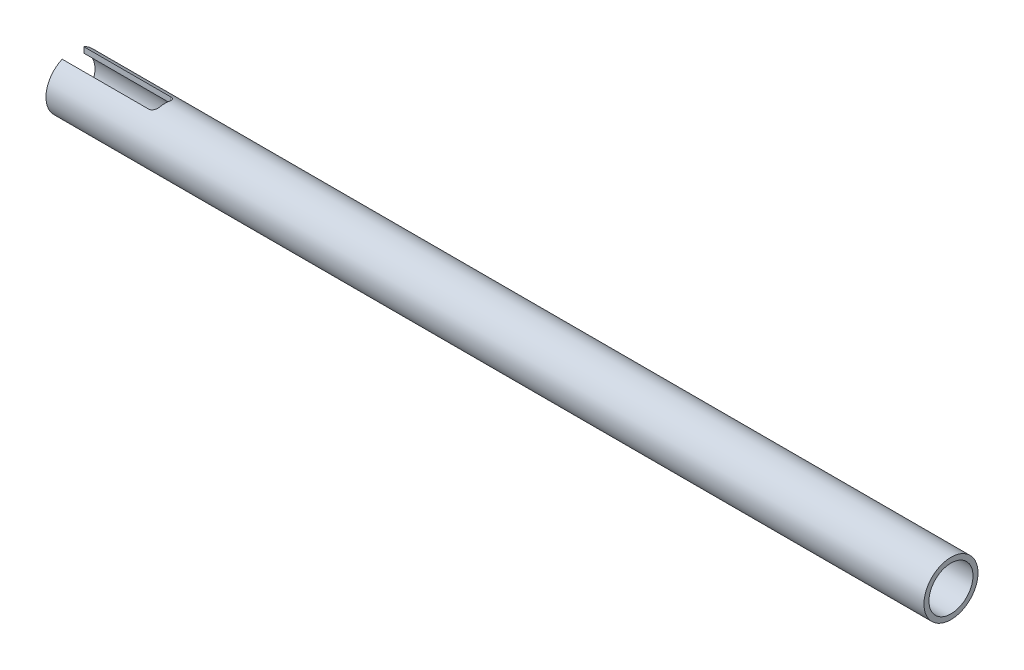
ISO-10303-21;
HEADER;
FILE_DESCRIPTION(('STEP AP214'),'2;1');
FILE_NAME('part.step','',(''),(''),'','','');
FILE_SCHEMA(('AUTOMOTIVE_DESIGN { 1 0 10303 214 1 1 1 1 }'));
ENDSEC;
DATA;
#1=APPLICATION_CONTEXT('core data for automotive mechanical design processes');
#2=APPLICATION_PROTOCOL_DEFINITION('international standard','automotive_design',2000,#1);
#3=PRODUCT_CONTEXT('',#1,'mechanical');
#4=PRODUCT('Part','Part','',(#3));
#5=PRODUCT_RELATED_PRODUCT_CATEGORY('part','',(#4));
#6=PRODUCT_DEFINITION_FORMATION('','',#4);
#7=PRODUCT_DEFINITION_CONTEXT('part definition',#1,'design');
#8=PRODUCT_DEFINITION('design','',#6,#7);
#9=PRODUCT_DEFINITION_SHAPE('','',#8);
#10=(LENGTH_UNIT() NAMED_UNIT(*) SI_UNIT(.MILLI.,.METRE.));
#11=(NAMED_UNIT(*) PLANE_ANGLE_UNIT() SI_UNIT($,.RADIAN.));
#12=(NAMED_UNIT(*) SI_UNIT($,.STERADIAN.) SOLID_ANGLE_UNIT());
#13=UNCERTAINTY_MEASURE_WITH_UNIT(LENGTH_MEASURE(1.E-05),#10,'distance_accuracy_value','');
#14=(GEOMETRIC_REPRESENTATION_CONTEXT(3) GLOBAL_UNCERTAINTY_ASSIGNED_CONTEXT((#13)) GLOBAL_UNIT_ASSIGNED_CONTEXT((#10,
#11,#12)) REPRESENTATION_CONTEXT('',''));
#15=CARTESIAN_POINT('',(0.,0.,0.));
#16=DIRECTION('',(0.,0.,1.));
#17=DIRECTION('',(1.,0.,0.));
#18=AXIS2_PLACEMENT_3D('',#15,#16,#17);
#19=CARTESIAN_POINT('',(-152.066380473343,0.,0.));
#20=DIRECTION('',(1.,0.,0.));
#21=DIRECTION('',(0.,0.,-1.));
#22=AXIS2_PLACEMENT_3D('',#19,#20,#21);
#23=CYLINDRICAL_SURFACE('',#22,7.9375);
#24=CARTESIAN_POINT('',(153.619959861945,1.11237104596928E-13,0.));
#25=DIRECTION('',(-1.,0.,0.));
#26=DIRECTION('',(0.,-1.,0.));
#27=AXIS2_PLACEMENT_3D('',#24,#25,#26);
#28=CIRCLE('',#27,7.9375);
#29=CARTESIAN_POINT('',(153.619959861945,-7.93749999999989,0.));
#30=VERTEX_POINT('',#29);
#31=EDGE_CURVE('E159',#30,#30,#28,.T.);
#32=ORIENTED_EDGE('',*,*,#31,.T.);
#33=EDGE_LOOP('',(#32));
#34=FACE_BOUND('',#33,.T.);
#35=CARTESIAN_POINT('',(-104.21574017067,0.,0.));
#36=DIRECTION('',(-1.,0.,0.));
#37=DIRECTION('',(0.,-1.,0.));
#38=AXIS2_PLACEMENT_3D('',#35,#36,#37);
#39=CIRCLE('',#38,7.9375);
#40=CARTESIAN_POINT('',(-104.21574017067,-7.2748389157424,-3.17499999999998));
#41=VERTEX_POINT('',#40);
#42=CARTESIAN_POINT('',(-104.21574017067,7.2748389157424,-3.17499999999999));
#43=VERTEX_POINT('',#42);
#44=EDGE_CURVE('E152',#41,#43,#39,.F.);
#45=ORIENTED_EDGE('',*,*,#44,.T.);
#46=DIRECTION('',(1.,0.,0.));
#47=VECTOR('',#46,1.);
#48=CARTESIAN_POINT('',(-152.066380473343,7.27483891574241,-3.17499999999997));
#49=LINE('',#48,#47);
#50=CARTESIAN_POINT('',(-78.8157401706699,7.27483891574241,-3.17499999999997));
#51=VERTEX_POINT('',#50);
#52=EDGE_CURVE('E261',#43,#51,#49,.T.);
#53=ORIENTED_EDGE('',*,*,#52,.T.);
#54=CARTESIAN_POINT('',(-78.8157401706699,7.27483891574241,-3.17499999999999));
#55=CARTESIAN_POINT('',(-78.7733686186877,7.27483586366098,-3.17500168113658));
#56=CARTESIAN_POINT('',(-78.7310189230243,7.27558001702575,-3.17330245165568));
#57=CARTESIAN_POINT('',(-78.6466531085546,7.27852818539399,-3.16653661877878));
#58=CARTESIAN_POINT('',(-78.6046368931729,7.28073176088511,-3.16147102917758));
#59=CARTESIAN_POINT('',(-78.479854535158,7.28945465778901,-3.14133450163409));
#60=CARTESIAN_POINT('',(-78.3979742160682,7.29808678684577,-3.12132308750014));
#61=CARTESIAN_POINT('',(-78.2391163280679,7.32026684625098,-3.06894040253671));
#62=CARTESIAN_POINT('',(-78.1621353528807,7.3338113164125,-3.03657783085927));
#63=CARTESIAN_POINT('',(-78.0147427725054,7.36480545430106,-2.96061234627714));
#64=CARTESIAN_POINT('',(-77.9443359156642,7.38225791423852,-2.91700139314278));
#65=CARTESIAN_POINT('',(-77.8086616267959,7.42075264717216,-2.81767453343914));
#66=CARTESIAN_POINT('',(-77.7437606170336,7.44191980144858,-2.76150754869699));
#67=CARTESIAN_POINT('',(-77.6240750933281,7.48594933347427,-2.63982081610503));
#68=CARTESIAN_POINT('',(-77.5692945813117,7.50881237683834,-2.5742973865362));
#69=CARTESIAN_POINT('',(-77.4676171942395,7.5565684344493,-2.43069507728352));
#70=CARTESIAN_POINT('',(-77.4215126652641,7.58149355937879,-2.35206470826203));
#71=CARTESIAN_POINT('',(-77.3433470610649,7.63048866953836,-2.18789362747877));
#72=CARTESIAN_POINT('',(-77.311278574458,7.65455909988382,-2.1023565909426));
#73=CARTESIAN_POINT('',(-77.2674535796852,7.69573507431979,-1.94541809174969));
#74=CARTESIAN_POINT('',(-77.2528184748395,7.71322855066072,-1.87491037842447));
#75=CARTESIAN_POINT('',(-77.2332027129857,7.74654000063457,-1.73219113401288));
#76=CARTESIAN_POINT('',(-77.228220882022,7.76235817778308,-1.65997981118743));
#77=CARTESIAN_POINT('',(-77.2282401706699,7.77712993333659,-1.58749999999999));
#78=B_SPLINE_CURVE_WITH_KNOTS('',3,(#54,#55,#56,#57,#58,#59,#60,#61,#62,#63,#64,#65,#66,#67,#68,
#69,#70,#71,#72,#73,#74,#75,#76,#77),.UNSPECIFIED.,.F.,.F.,(4,2,2,2,2,2,2,2,2,2,2,4),(0.,
0.127031494291915,0.254024749792393,0.506885265042634,0.759568013575115,1.01243188015946,
1.27651034681328,1.54069301498296,1.82289095795801,2.1049397130359,2.32661111398099,
2.54825555529032),.UNSPECIFIED.);
#79=CARTESIAN_POINT('',(-77.2282401706699,7.77712993333659,-1.58749999999999));
#80=VERTEX_POINT('',#79);
#81=EDGE_CURVE('E231',#51,#80,#78,.T.);
#82=ORIENTED_EDGE('',*,*,#81,.T.);
#83=CARTESIAN_POINT('',(-77.2282401706699,0.,0.));
#84=DIRECTION('',(-1.,0.,0.));
#85=DIRECTION('',(0.,0.,1.));
#86=AXIS2_PLACEMENT_3D('',#83,#84,#85);
#87=CIRCLE('',#86,7.9375);
#88=CARTESIAN_POINT('',(-77.2282401706699,7.77712993333659,1.58750000000001));
#89=VERTEX_POINT('',#88);
#90=EDGE_CURVE('E260',#80,#89,#87,.F.);
#91=ORIENTED_EDGE('',*,*,#90,.T.);
#92=CARTESIAN_POINT('',(-77.2282401706699,7.77712993333659,1.58750000000001));
#93=CARTESIAN_POINT('',(-77.2282404142602,7.76774126330065,1.63350676862773));
#94=CARTESIAN_POINT('',(-77.2302410753772,7.75794444810861,1.67940359564177));
#95=CARTESIAN_POINT('',(-77.2381784386956,7.73762089991974,1.77068039580911));
#96=CARTESIAN_POINT('',(-77.2441141074439,7.72709435922087,1.81606050148705));
#97=CARTESIAN_POINT('',(-77.2676870566949,7.6945984520111,1.95078228156833));
#98=CARTESIAN_POINT('',(-77.2910910036172,7.67166299368629,2.03894812030823));
#99=CARTESIAN_POINT('',(-77.3523712007889,7.62428385726793,2.20953807004377));
#100=CARTESIAN_POINT('',(-77.3902398910487,7.59984097261638,2.29196515383516));
#101=CARTESIAN_POINT('',(-77.4793871610905,7.55064502184106,2.44917385980106));
#102=CARTESIAN_POINT('',(-77.5306713285352,7.52589183057164,2.52395227814499));
#103=CARTESIAN_POINT('',(-77.6466583764906,7.47696931777062,2.66543932718694));
#104=CARTESIAN_POINT('',(-77.711627101606,7.45282414598359,2.73193883493113));
#105=CARTESIAN_POINT('',(-77.8527653154389,7.40732925012121,2.85299322074862));
#106=CARTESIAN_POINT('',(-77.9289351987707,7.38597962458242,2.90754767783194));
#107=CARTESIAN_POINT('',(-78.0885088992545,7.34825600672414,3.00159155783956));
#108=CARTESIAN_POINT('',(-78.1716833545148,7.33177064627854,3.04142452291152));
#109=CARTESIAN_POINT('',(-78.3444539866154,7.30455577634143,3.10622330269327));
#110=CARTESIAN_POINT('',(-78.434038863784,7.29381640854949,3.13121458917045));
#111=CARTESIAN_POINT('',(-78.5730866835516,7.28263004031741,3.15710194076301));
#112=CARTESIAN_POINT('',(-78.6213419103924,7.27971714426163,3.16380495831029));
#113=CARTESIAN_POINT('',(-78.7183013288217,7.2758193784974,3.17275416759985));
#114=CARTESIAN_POINT('',(-78.7670051297396,7.27483296598247,3.17500392571317));
#115=CARTESIAN_POINT('',(-78.8157401706699,7.27483891574239,3.17500000000001));
#116=B_SPLINE_CURVE_WITH_KNOTS('',3,(#92,#93,#94,#95,#96,#97,#98,#99,#100,#101,#102,#103,#104,
#105,#106,#107,#108,#109,#110,#111,#112,#113,#114,#115),.UNSPECIFIED.,.F.,.F.,(4,2,2,2,2,2,2,2,
2,2,2,4),(0.,0.140770845296603,0.281504734514009,0.562238948643029,0.842826637517776,
1.12353138019525,1.41029752992662,1.69707378478449,1.97665708187307,2.255759151943,
2.40195937855945,2.54804247399298),.UNSPECIFIED.);
#117=CARTESIAN_POINT('',(-78.8157401706699,7.27483891574237,3.17500000000004));
#118=VERTEX_POINT('',#117);
#119=EDGE_CURVE('E48',#89,#118,#116,.T.);
#120=ORIENTED_EDGE('',*,*,#119,.T.);
#121=DIRECTION('',(1.,0.,0.));
#122=VECTOR('',#121,1.);
#123=CARTESIAN_POINT('',(-152.066380473343,7.27483891574237,3.17500000000004));
#124=LINE('',#123,#122);
#125=CARTESIAN_POINT('',(-104.21574017067,7.27483891574239,3.17500000000002));
#126=VERTEX_POINT('',#125);
#127=EDGE_CURVE('E274',#118,#126,#124,.F.);
#128=ORIENTED_EDGE('',*,*,#127,.T.);
#129=CARTESIAN_POINT('',(-104.21574017067,-7.27483891574239,3.17500000000002));
#130=VERTEX_POINT('',#129);
#131=EDGE_CURVE('E156',#126,#130,#39,.F.);
#132=ORIENTED_EDGE('',*,*,#131,.T.);
#133=DIRECTION('',(1.,0.,0.));
#134=VECTOR('',#133,1.);
#135=CARTESIAN_POINT('',(-152.066380473343,-7.27483891574237,3.17500000000005));
#136=LINE('',#135,#134);
#137=CARTESIAN_POINT('',(-78.8157401706699,-7.27483891574237,3.17500000000005));
#138=VERTEX_POINT('',#137);
#139=EDGE_CURVE('E133',#130,#138,#136,.T.);
#140=ORIENTED_EDGE('',*,*,#139,.T.);
#141=CARTESIAN_POINT('',(-78.8157401706699,-7.27483891574237,3.17500000000001));
#142=CARTESIAN_POINT('',(-78.7733686186877,-7.27483586366097,3.17500168113659));
#143=CARTESIAN_POINT('',(-78.7310189230243,-7.27558001702575,3.17330245165569));
#144=CARTESIAN_POINT('',(-78.6466531085546,-7.27852818539399,3.1665366187788));
#145=CARTESIAN_POINT('',(-78.6046368931729,-7.28073176088511,3.1614710291776));
#146=CARTESIAN_POINT('',(-78.479854535158,-7.289454657789,3.1413345016341));
#147=CARTESIAN_POINT('',(-78.3979742160682,-7.29808678684576,3.12132308750015));
#148=CARTESIAN_POINT('',(-78.2391163280679,-7.32026684625098,3.06894040253673));
#149=CARTESIAN_POINT('',(-78.1621353528807,-7.3338113164125,3.03657783085928));
#150=CARTESIAN_POINT('',(-78.0147427725054,-7.36480545430105,2.96061234627716));
#151=CARTESIAN_POINT('',(-77.9443359156642,-7.38225791423852,2.91700139314279));
#152=CARTESIAN_POINT('',(-77.8086616267959,-7.42075264717216,2.81767453343915));
#153=CARTESIAN_POINT('',(-77.7437606170336,-7.44191980144858,2.76150754869701));
#154=CARTESIAN_POINT('',(-77.6240750933281,-7.48594933347426,2.63982081610504));
#155=CARTESIAN_POINT('',(-77.5692945813117,-7.50881237683834,2.57429738653622));
#156=CARTESIAN_POINT('',(-77.4676171942395,-7.55656843444929,2.43069507728353));
#157=CARTESIAN_POINT('',(-77.4215126652641,-7.58149355937878,2.35206470826204));
#158=CARTESIAN_POINT('',(-77.3433470610649,-7.63048866953836,2.18789362747879));
#159=CARTESIAN_POINT('',(-77.311278574458,-7.65455909988382,2.10235659094261));
#160=CARTESIAN_POINT('',(-77.2674535796852,-7.69573507431979,1.94541809174971));
#161=CARTESIAN_POINT('',(-77.2528184748395,-7.71322855066071,1.87491037842448));
#162=CARTESIAN_POINT('',(-77.2332027129857,-7.74654000063457,1.73219113401289));
#163=CARTESIAN_POINT('',(-77.228220882022,-7.76235817778308,1.65997981118744));
#164=CARTESIAN_POINT('',(-77.2282401706699,-7.77712993333659,1.58750000000001));
#165=B_SPLINE_CURVE_WITH_KNOTS('',3,(#141,#142,#143,#144,#145,#146,#147,#148,#149,#150,#151,
#152,#153,#154,#155,#156,#157,#158,#159,#160,#161,#162,#163,#164),.UNSPECIFIED.,.F.,.F.,(4,2,2,
2,2,2,2,2,2,2,2,4),(0.,0.127031494291929,0.254024749792393,0.506885265042634,0.7595680135751,
1.01243188015946,1.27651034681327,1.54069301498297,1.82289095795802,2.1049397130359,
2.32661111398099,2.54825555529032),.UNSPECIFIED.);
#166=CARTESIAN_POINT('',(-77.2282401706699,-7.77712993333659,1.58750000000001));
#167=VERTEX_POINT('',#166);
#168=EDGE_CURVE('E225',#138,#167,#165,.T.);
#169=ORIENTED_EDGE('',*,*,#168,.T.);
#170=CARTESIAN_POINT('',(-77.2282401706699,-7.77712993333659,-1.58749999999999));
#171=VERTEX_POINT('',#170);
#172=EDGE_CURVE('E268',#167,#171,#87,.F.);
#173=ORIENTED_EDGE('',*,*,#172,.T.);
#174=CARTESIAN_POINT('',(-77.2282401706699,-7.77712993333659,-1.58749999999999));
#175=CARTESIAN_POINT('',(-77.2282404142602,-7.76774126330065,-1.63350676862772));
#176=CARTESIAN_POINT('',(-77.2302410753772,-7.75794444810862,-1.67940359564176));
#177=CARTESIAN_POINT('',(-77.2381784386956,-7.73762089991974,-1.7706803958091));
#178=CARTESIAN_POINT('',(-77.2441141074439,-7.72709435922088,-1.81606050148704));
#179=CARTESIAN_POINT('',(-77.2676870566949,-7.6945984520111,-1.95078228156832));
#180=CARTESIAN_POINT('',(-77.2910910036172,-7.67166299368629,-2.03894812030822));
#181=CARTESIAN_POINT('',(-77.3523712007889,-7.62428385726794,-2.20953807004375));
#182=CARTESIAN_POINT('',(-77.3902398910487,-7.59984097261638,-2.29196515383514));
#183=CARTESIAN_POINT('',(-77.4793871610905,-7.55064502184107,-2.44917385980104));
#184=CARTESIAN_POINT('',(-77.5306713285352,-7.52589183057165,-2.52395227814498));
#185=CARTESIAN_POINT('',(-77.6466583764906,-7.47696931777062,-2.66543932718693));
#186=CARTESIAN_POINT('',(-77.711627101606,-7.4528241459836,-2.73193883493112));
#187=CARTESIAN_POINT('',(-77.8527653154389,-7.40732925012122,-2.8529932207486));
#188=CARTESIAN_POINT('',(-77.9289351987707,-7.38597962458242,-2.90754767783192));
#189=CARTESIAN_POINT('',(-78.0885088992545,-7.34825600672415,-3.00159155783954));
#190=CARTESIAN_POINT('',(-78.1716833545148,-7.33177064627855,-3.0414245229115));
#191=CARTESIAN_POINT('',(-78.3444539866154,-7.30455577634143,-3.10622330269325));
#192=CARTESIAN_POINT('',(-78.434038863784,-7.2938164085495,-3.13121458917044));
#193=CARTESIAN_POINT('',(-78.5730866835516,-7.28263004031741,-3.157101940763));
#194=CARTESIAN_POINT('',(-78.6213419103924,-7.27971714426164,-3.16380495831028));
#195=CARTESIAN_POINT('',(-78.7183013288217,-7.2758193784974,-3.17275416759984));
#196=CARTESIAN_POINT('',(-78.7670051297396,-7.27483296598247,-3.17500392571315));
#197=CARTESIAN_POINT('',(-78.8157401706699,-7.2748389157424,-3.17499999999999));
#198=B_SPLINE_CURVE_WITH_KNOTS('',3,(#174,#175,#176,#177,#178,#179,#180,#181,#182,#183,#184,
#185,#186,#187,#188,#189,#190,#191,#192,#193,#194,#195,#196,#197),.UNSPECIFIED.,.F.,.F.,(4,2,2,
2,2,2,2,2,2,2,2,4),(0.,0.140770845296603,0.28150473451401,0.56223894864303,0.842826637517771,
1.12353138019525,1.41029752992662,1.69707378478449,1.97665708187304,2.255759151943,
2.40195937855945,2.54804247399298),.UNSPECIFIED.);
#199=CARTESIAN_POINT('',(-78.8157401706699,-7.27483891574241,-3.17499999999997));
#200=VERTEX_POINT('',#199);
#201=EDGE_CURVE('E196',#171,#200,#198,.T.);
#202=ORIENTED_EDGE('',*,*,#201,.T.);
#203=DIRECTION('',(1.,0.,0.));
#204=VECTOR('',#203,1.);
#205=CARTESIAN_POINT('',(-152.066380473343,-7.27483891574241,-3.17499999999997));
#206=LINE('',#205,#204);
#207=EDGE_CURVE('E269',#200,#41,#206,.F.);
#208=ORIENTED_EDGE('',*,*,#207,.T.);
#209=EDGE_LOOP('',(#45,#53,#82,#91,#120,#128,#132,#140,#169,#173,#202,#208));
#210=FACE_BOUND('',#209,.T.);
#211=ADVANCED_FACE('F34',(#34,#210),#23,.T.);
#212=CARTESIAN_POINT('',(-152.066380473343,0.,0.));
#213=DIRECTION('',(1.,0.,0.));
#214=DIRECTION('',(0.,0.,-1.));
#215=AXIS2_PLACEMENT_3D('',#212,#213,#214);
#216=CYLINDRICAL_SURFACE('',#215,6.4643);
#217=CARTESIAN_POINT('',(153.619959861945,1.11237104596928E-13,0.));
#218=DIRECTION('',(-1.,0.,0.));
#219=DIRECTION('',(0.,-1.,0.));
#220=AXIS2_PLACEMENT_3D('',#217,#218,#219);
#221=CIRCLE('',#220,6.4643);
#222=CARTESIAN_POINT('',(153.619959861945,-6.46429999999989,0.));
#223=VERTEX_POINT('',#222);
#224=EDGE_CURVE('E283',#223,#223,#221,.T.);
#225=ORIENTED_EDGE('',*,*,#224,.F.);
#226=EDGE_LOOP('',(#225));
#227=FACE_BOUND('',#226,.T.);
#228=DIRECTION('',(1.,0.,0.));
#229=VECTOR('',#228,1.);
#230=CARTESIAN_POINT('',(-152.066380473343,5.63085690548074,-3.17499999999997));
#231=LINE('',#230,#229);
#232=CARTESIAN_POINT('',(-104.21574017067,5.63085690548074,-3.17499999999999));
#233=VERTEX_POINT('',#232);
#234=CARTESIAN_POINT('',(-78.8157401706699,5.63085690548074,-3.17499999999997));
#235=VERTEX_POINT('',#234);
#236=EDGE_CURVE('E272',#233,#235,#231,.T.);
#237=ORIENTED_EDGE('',*,*,#236,.F.);
#238=CARTESIAN_POINT('',(-104.21574017067,0.,0.));
#239=DIRECTION('',(-1.,0.,0.));
#240=DIRECTION('',(0.,-1.,0.));
#241=AXIS2_PLACEMENT_3D('',#238,#239,#240);
#242=CIRCLE('',#241,6.4643);
#243=CARTESIAN_POINT('',(-104.21574017067,-5.63085690548074,-3.17499999999999));
#244=VERTEX_POINT('',#243);
#245=EDGE_CURVE('E139',#244,#233,#242,.F.);
#246=ORIENTED_EDGE('',*,*,#245,.F.);
#247=DIRECTION('',(1.,0.,0.));
#248=VECTOR('',#247,1.);
#249=CARTESIAN_POINT('',(-152.066380473343,-5.63085690548074,-3.17499999999997));
#250=LINE('',#249,#248);
#251=CARTESIAN_POINT('',(-78.8157401706699,-5.63085690548074,-3.17499999999997));
#252=VERTEX_POINT('',#251);
#253=EDGE_CURVE('E276',#252,#244,#250,.F.);
#254=ORIENTED_EDGE('',*,*,#253,.F.);
#255=CARTESIAN_POINT('',(-78.8157401706699,-5.63085690548074,-3.17499999999999));
#256=CARTESIAN_POINT('',(-78.7745833399948,-5.6308524315094,-3.1750026594243));
#257=CARTESIAN_POINT('',(-78.7334488178204,-5.63176028239597,-3.17339835018605));
#258=CARTESIAN_POINT('',(-78.6515230024798,-5.63535215701951,-3.16701766507686));
#259=CARTESIAN_POINT('',(-78.6107315616386,-5.63803537228505,-3.1622427330513));
#260=CARTESIAN_POINT('',(-78.489736334865,-5.64863522411123,-3.14329664507893));
#261=CARTESIAN_POINT('',(-78.4104242824242,-5.65910325483873,-3.12450305374454));
#262=CARTESIAN_POINT('',(-78.2566743879259,-5.68588522764518,-3.07549165040549));
#263=CARTESIAN_POINT('',(-78.182229927606,-5.70219102829141,-3.04528974537459));
#264=CARTESIAN_POINT('',(-78.0395623066099,-5.73938277272118,-2.97460119282055));
#265=CARTESIAN_POINT('',(-77.9713464227191,-5.76027397904374,-2.9341027196942));
#266=CARTESIAN_POINT('',(-77.838068454459,-5.80676804025647,-2.8410377337842));
#267=CARTESIAN_POINT('',(-77.7735222923967,-5.83259254506422,-2.78784532739571));
#268=CARTESIAN_POINT('',(-77.6539555823588,-5.88631786935969,-2.6725426336996));
#269=CARTESIAN_POINT('',(-77.5989395015251,-5.91421965383983,-2.61042818908351));
#270=CARTESIAN_POINT('',(-77.4939226532182,-5.97373371686979,-2.47143371409534));
#271=CARTESIAN_POINT('',(-77.4451122336623,-6.00542032126397,-2.39368295701581));
#272=CARTESIAN_POINT('',(-77.3614848356118,-6.0678536497522,-2.23068225215679));
#273=CARTESIAN_POINT('',(-77.326660832639,-6.09860083846707,-2.14543609512389));
#274=CARTESIAN_POINT('',(-77.2760635590066,-6.15341243852268,-1.98216120584021));
#275=CARTESIAN_POINT('',(-77.2582666480713,-6.17780100436403,-1.90486553835024));
#276=CARTESIAN_POINT('',(-77.2343374802621,-6.22410888754504,-1.74771289593287));
#277=CARTESIAN_POINT('',(-77.2282143571783,-6.24602625877211,-1.66785396509171));
#278=CARTESIAN_POINT('',(-77.2282401706699,-6.26634009929241,-1.58749999999999));
#279=B_SPLINE_CURVE_WITH_KNOTS('',3,(#255,#256,#257,#258,#259,#260,#261,#262,#263,#264,#265,
#266,#267,#268,#269,#270,#271,#272,#273,#274,#275,#276,#277,#278),.UNSPECIFIED.,.F.,.F.,(4,2,2,
2,2,2,2,2,2,2,2,4),(0.,0.123386261727165,0.246716374037833,0.491934980105696,0.736812924701841,
0.981973392060174,1.24352761602778,1.50520411142377,1.7952497086635,2.08514945193375,
2.33322496948238,2.58149450643057),.UNSPECIFIED.);
#280=CARTESIAN_POINT('',(-77.2282401706699,-6.26634009929241,-1.58749999999999));
#281=VERTEX_POINT('',#280);
#282=EDGE_CURVE('E189',#252,#281,#279,.T.);
#283=ORIENTED_EDGE('',*,*,#282,.T.);
#284=CARTESIAN_POINT('',(-77.2282401706699,0.,0.));
#285=DIRECTION('',(-1.,0.,0.));
#286=DIRECTION('',(0.,0.,1.));
#287=AXIS2_PLACEMENT_3D('',#284,#285,#286);
#288=CIRCLE('',#287,6.4643);
#289=CARTESIAN_POINT('',(-77.2282401706699,-6.26634009929241,1.58750000000001));
#290=VERTEX_POINT('',#289);
#291=EDGE_CURVE('E170',#290,#281,#288,.F.);
#292=ORIENTED_EDGE('',*,*,#291,.F.);
#293=CARTESIAN_POINT('',(-77.2282401706699,-6.26634009929241,1.58750000000001));
#294=CARTESIAN_POINT('',(-77.2282403920852,-6.25451519937794,1.63418900680279));
#295=CARTESIAN_POINT('',(-77.2303006846255,-6.2421690242475,1.68071621150092));
#296=CARTESIAN_POINT('',(-77.2384490963096,-6.21654599792506,1.77313930969814));
#297=CARTESIAN_POINT('',(-77.2445356712762,-6.20326950527711,1.81903543834438));
#298=CARTESIAN_POINT('',(-77.2686465950246,-6.16228683989147,1.95507469082073));
#299=CARTESIAN_POINT('',(-77.292523413963,-6.13334935224697,2.04387534201679));
#300=CARTESIAN_POINT('',(-77.3548081203105,-6.07353181019977,2.21532061503983));
#301=CARTESIAN_POINT('',(-77.3932004020916,-6.04265387160463,2.29797173444356));
#302=CARTESIAN_POINT('',(-77.4834353559862,-5.98038883139862,2.45546303738965));
#303=CARTESIAN_POINT('',(-77.5352885878067,-5.94900134826911,2.53029702370296));
#304=CARTESIAN_POINT('',(-77.6534123046791,-5.88635884745834,2.67287075398234));
#305=CARTESIAN_POINT('',(-77.7201361903183,-5.85514963173659,2.74025626996524));
#306=CARTESIAN_POINT('',(-77.86547345169,-5.79626340236597,2.8627136807605));
#307=CARTESIAN_POINT('',(-77.9440868209551,-5.76858638679577,2.91778558227086));
#308=CARTESIAN_POINT('',(-78.1083087552007,-5.72010524984432,3.0116887265663));
#309=CARTESIAN_POINT('',(-78.1935513585408,-5.69908490291319,3.05104502216776));
#310=CARTESIAN_POINT('',(-78.3709521530204,-5.6647688681487,3.11430373465246));
#311=CARTESIAN_POINT('',(-78.4630919523634,-5.65145340907629,3.13824572360376));
#312=CARTESIAN_POINT('',(-78.5995849602377,-5.63883740321026,3.16081362599347));
#313=CARTESIAN_POINT('',(-78.6425937073042,-5.63585394797714,3.16612512648616));
#314=CARTESIAN_POINT('',(-78.7289717479083,-5.63186201493137,3.17321828948631));
#315=CARTESIAN_POINT('',(-78.772340866727,-5.63085263040864,3.1750015725431));
#316=CARTESIAN_POINT('',(-78.8157401706699,-5.63085690548072,3.17500000000001));
#317=B_SPLINE_CURVE_WITH_KNOTS('',3,(#293,#294,#295,#296,#297,#298,#299,#300,#301,#302,#303,
#304,#305,#306,#307,#308,#309,#310,#311,#312,#313,#314,#315,#316),.UNSPECIFIED.,.F.,.F.,(4,2,2,
2,2,2,2,2,2,2,2,4),(0.,0.144388740940302,0.288722137366157,0.576452128922379,0.86387365648991,
1.15152134248761,1.44956694911565,1.74761239362143,2.03464137858758,2.32093052452346,
2.45108160789038,2.58117289753275),.UNSPECIFIED.);
#318=CARTESIAN_POINT('',(-78.8157401706699,-5.6308569054807,3.17500000000005));
#319=VERTEX_POINT('',#318);
#320=EDGE_CURVE('E147',#290,#319,#317,.T.);
#321=ORIENTED_EDGE('',*,*,#320,.T.);
#322=DIRECTION('',(1.,0.,0.));
#323=VECTOR('',#322,1.);
#324=CARTESIAN_POINT('',(-152.066380473343,-5.6308569054807,3.17500000000005));
#325=LINE('',#324,#323);
#326=CARTESIAN_POINT('',(-104.21574017067,-5.63085690548072,3.17500000000002));
#327=VERTEX_POINT('',#326);
#328=EDGE_CURVE('E130',#327,#319,#325,.T.);
#329=ORIENTED_EDGE('',*,*,#328,.F.);
#330=CARTESIAN_POINT('',(-104.21574017067,5.63085690548072,3.17500000000002));
#331=VERTEX_POINT('',#330);
#332=EDGE_CURVE('E145',#331,#327,#242,.F.);
#333=ORIENTED_EDGE('',*,*,#332,.F.);
#334=DIRECTION('',(1.,0.,0.));
#335=VECTOR('',#334,1.);
#336=CARTESIAN_POINT('',(-152.066380473343,5.6308569054807,3.17500000000005));
#337=LINE('',#336,#335);
#338=CARTESIAN_POINT('',(-78.8157401706699,5.6308569054807,3.17500000000005));
#339=VERTEX_POINT('',#338);
#340=EDGE_CURVE('E278',#339,#331,#337,.F.);
#341=ORIENTED_EDGE('',*,*,#340,.F.);
#342=CARTESIAN_POINT('',(-78.8157401706699,5.6308569054807,3.17500000000001));
#343=CARTESIAN_POINT('',(-78.7745833399947,5.63085243150938,3.17500265942432));
#344=CARTESIAN_POINT('',(-78.7334488178204,5.63176028239596,3.17339835018607));
#345=CARTESIAN_POINT('',(-78.6515230024797,5.6353521570195,3.16701766507687));
#346=CARTESIAN_POINT('',(-78.6107315616386,5.63803537228504,3.16224273305131));
#347=CARTESIAN_POINT('',(-78.489736334865,5.64863522411122,3.14329664507894));
#348=CARTESIAN_POINT('',(-78.4104242824242,5.65910325483872,3.12450305374455));
#349=CARTESIAN_POINT('',(-78.2566743879259,5.68588522764517,3.0754916504055));
#350=CARTESIAN_POINT('',(-78.182229927606,5.7021910282914,3.04528974537461));
#351=CARTESIAN_POINT('',(-78.0395623066099,5.73938277272117,2.97460119282056));
#352=CARTESIAN_POINT('',(-77.9713464227191,5.76027397904373,2.93410271969421));
#353=CARTESIAN_POINT('',(-77.838068454459,5.80676804025647,2.84103773378421));
#354=CARTESIAN_POINT('',(-77.7735222923967,5.83259254506422,2.78784532739572));
#355=CARTESIAN_POINT('',(-77.6539555823588,5.88631786935968,2.67254263369961));
#356=CARTESIAN_POINT('',(-77.5989395015251,5.91421965383983,2.61042818908352));
#357=CARTESIAN_POINT('',(-77.4939226532182,5.97373371686978,2.47143371409536));
#358=CARTESIAN_POINT('',(-77.4451122336623,6.00542032126396,2.39368295701582));
#359=CARTESIAN_POINT('',(-77.3614848356118,6.0678536497522,2.2306822521568));
#360=CARTESIAN_POINT('',(-77.326660832639,6.09860083846706,2.14543609512391));
#361=CARTESIAN_POINT('',(-77.2760635590066,6.15341243852268,1.98216120584023));
#362=CARTESIAN_POINT('',(-77.2582666480713,6.17780100436403,1.90486553835026));
#363=CARTESIAN_POINT('',(-77.2343374802621,6.22410888754503,1.74771289593288));
#364=CARTESIAN_POINT('',(-77.2282143571783,6.24602625877211,1.66785396509172));
#365=CARTESIAN_POINT('',(-77.2282401706699,6.26634009929241,1.58750000000001));
#366=B_SPLINE_CURVE_WITH_KNOTS('',3,(#342,#343,#344,#345,#346,#347,#348,#349,#350,#351,#352,
#353,#354,#355,#356,#357,#358,#359,#360,#361,#362,#363,#364,#365),.UNSPECIFIED.,.F.,.F.,(4,2,2,
2,2,2,2,2,2,2,2,4),(0.,0.12338626172718,0.246716374037834,0.491934980105697,0.736812924701841,
0.981973392060174,1.24352761602778,1.50520411142377,1.7952497086635,2.08514945193375,
2.33322496948238,2.58149450643057),.UNSPECIFIED.);
#367=CARTESIAN_POINT('',(-77.2282401706699,6.26634009929241,1.58750000000001));
#368=VERTEX_POINT('',#367);
#369=EDGE_CURVE('E12',#339,#368,#366,.T.);
#370=ORIENTED_EDGE('',*,*,#369,.T.);
#371=CARTESIAN_POINT('',(-77.2282401706699,6.26634009929241,-1.58749999999999));
#372=VERTEX_POINT('',#371);
#373=EDGE_CURVE('E166',#372,#368,#288,.F.);
#374=ORIENTED_EDGE('',*,*,#373,.F.);
#375=CARTESIAN_POINT('',(-77.2282401706699,6.26634009929241,-1.58749999999999));
#376=CARTESIAN_POINT('',(-77.2282403920852,6.25451519937794,-1.63418900680278));
#377=CARTESIAN_POINT('',(-77.2303006846255,6.2421690242475,-1.6807162115009));
#378=CARTESIAN_POINT('',(-77.2384490963096,6.21654599792507,-1.77313930969813));
#379=CARTESIAN_POINT('',(-77.2445356712762,6.20326950527711,-1.81903543834436));
#380=CARTESIAN_POINT('',(-77.2686465950246,6.16228683989147,-1.95507469082072));
#381=CARTESIAN_POINT('',(-77.292523413963,6.13334935224698,-2.04387534201677));
#382=CARTESIAN_POINT('',(-77.3548081203104,6.07353181019978,-2.21532061503981));
#383=CARTESIAN_POINT('',(-77.3932004020916,6.04265387160463,-2.29797173444354));
#384=CARTESIAN_POINT('',(-77.4834353559862,5.98038883139863,-2.45546303738963));
#385=CARTESIAN_POINT('',(-77.5352885878066,5.94900134826912,-2.53029702370294));
#386=CARTESIAN_POINT('',(-77.6534123046791,5.88635884745835,-2.67287075398233));
#387=CARTESIAN_POINT('',(-77.7201361903183,5.85514963173659,-2.74025626996522));
#388=CARTESIAN_POINT('',(-77.86547345169,5.79626340236598,-2.86271368076049));
#389=CARTESIAN_POINT('',(-77.9440868209551,5.76858638679577,-2.91778558227084));
#390=CARTESIAN_POINT('',(-78.1083087552007,5.72010524984432,-3.01168872656629));
#391=CARTESIAN_POINT('',(-78.1935513585407,5.6990849029132,-3.05104502216775));
#392=CARTESIAN_POINT('',(-78.3709521530203,5.66476886814871,-3.11430373465244));
#393=CARTESIAN_POINT('',(-78.4630919523634,5.6514534090763,-3.13824572360375));
#394=CARTESIAN_POINT('',(-78.5995849602377,5.63883740321027,-3.16081362599346));
#395=CARTESIAN_POINT('',(-78.6425937073041,5.63585394797715,-3.16612512648615));
#396=CARTESIAN_POINT('',(-78.7289717479083,5.63186201493138,-3.1732182894863));
#397=CARTESIAN_POINT('',(-78.772340866727,5.63085263040865,-3.17500157254309));
#398=CARTESIAN_POINT('',(-78.8157401706699,5.63085690548073,-3.17499999999999));
#399=B_SPLINE_CURVE_WITH_KNOTS('',3,(#375,#376,#377,#378,#379,#380,#381,#382,#383,#384,#385,
#386,#387,#388,#389,#390,#391,#392,#393,#394,#395,#396,#397,#398),.UNSPECIFIED.,.F.,.F.,(4,2,2,
2,2,2,2,2,2,2,2,4),(0.,0.144388740940301,0.288722137366156,0.576452128922374,0.863873656489894,
1.15152134248761,1.44956694911565,1.74761239362143,2.03464137858757,2.32093052452345,
2.45108160789039,2.58117289753275),.UNSPECIFIED.);
#400=EDGE_CURVE('E250',#372,#235,#399,.T.);
#401=ORIENTED_EDGE('',*,*,#400,.T.);
#402=EDGE_LOOP('',(#237,#246,#254,#283,#292,#321,#329,#333,#341,#370,#374,#401));
#403=FACE_BOUND('',#402,.T.);
#404=ADVANCED_FACE('F144',(#227,#403),#216,.F.);
#405=CARTESIAN_POINT('',(-104.21574017067,1.02963272203703E-13,-4.7625));
#406=DIRECTION('',(-1.,0.,0.));
#407=DIRECTION('',(0.,1.,0.));
#408=AXIS2_PLACEMENT_3D('',#405,#406,#407);
#409=PLANE('',#408);
#410=ORIENTED_EDGE('',*,*,#44,.F.);
#411=DIRECTION('',(0.,1.,0.));
#412=VECTOR('',#411,1.);
#413=CARTESIAN_POINT('',(-104.21574017067,1.03145027855898E-13,-3.17499999999999));
#414=LINE('',#413,#412);
#415=EDGE_CURVE('E165',#41,#244,#414,.T.);
#416=ORIENTED_EDGE('',*,*,#415,.T.);
#417=ORIENTED_EDGE('',*,*,#245,.T.);
#418=EDGE_CURVE('E162',#233,#43,#414,.T.);
#419=ORIENTED_EDGE('',*,*,#418,.T.);
#420=EDGE_LOOP('',(#410,#416,#417,#419));
#421=FACE_BOUND('',#420,.T.);
#422=ADVANCED_FACE('F212',(#421),#409,.T.);
#423=ORIENTED_EDGE('',*,*,#131,.F.);
#424=DIRECTION('',(0.,-1.,0.));
#425=VECTOR('',#424,1.);
#426=CARTESIAN_POINT('',(-104.21574017067,1.0387205046468E-13,3.17500000000002));
#427=LINE('',#426,#425);
#428=EDGE_CURVE('E138',#126,#331,#427,.T.);
#429=ORIENTED_EDGE('',*,*,#428,.T.);
#430=ORIENTED_EDGE('',*,*,#332,.T.);
#431=EDGE_CURVE('E127',#327,#130,#427,.T.);
#432=ORIENTED_EDGE('',*,*,#431,.T.);
#433=EDGE_LOOP('',(#423,#429,#430,#432));
#434=FACE_BOUND('',#433,.T.);
#435=ADVANCED_FACE('F150',(#434),#409,.T.);
#436=CARTESIAN_POINT('',(153.619959861945,1.11237104596928E-13,0.));
#437=DIRECTION('',(-1.,0.,0.));
#438=DIRECTION('',(0.,-1.,0.));
#439=AXIS2_PLACEMENT_3D('',#436,#437,#438);
#440=PLANE('',#439);
#441=ORIENTED_EDGE('',*,*,#224,.T.);
#442=EDGE_LOOP('',(#441));
#443=FACE_BOUND('',#442,.T.);
#444=ORIENTED_EDGE('',*,*,#31,.F.);
#445=EDGE_LOOP('',(#444));
#446=FACE_BOUND('',#445,.T.);
#447=ADVANCED_FACE('F241',(#443,#446),#440,.F.);
#448=CARTESIAN_POINT('',(-78.8157401706699,-7.9375,-3.17499999999999));
#449=DIRECTION('',(0.,0.,1.));
#450=DIRECTION('',(1.,0.,0.));
#451=AXIS2_PLACEMENT_3D('',#448,#449,#450);
#452=PLANE('',#451);
#453=ORIENTED_EDGE('',*,*,#207,.F.);
#454=DIRECTION('',(0.,1.,0.));
#455=VECTOR('',#454,1.);
#456=CARTESIAN_POINT('',(-78.8157401706699,-5.63085690548073,-3.17499999999999));
#457=LINE('',#456,#455);
#458=EDGE_CURVE('E169',#200,#252,#457,.T.);
#459=ORIENTED_EDGE('',*,*,#458,.T.);
#460=ORIENTED_EDGE('',*,*,#253,.T.);
#461=ORIENTED_EDGE('',*,*,#415,.F.);
#462=EDGE_LOOP('',(#453,#459,#460,#461));
#463=FACE_BOUND('',#462,.T.);
#464=ADVANCED_FACE('F299',(#463),#452,.T.);
#465=CARTESIAN_POINT('',(-77.2282401706699,-7.9375,3.17500000000001));
#466=DIRECTION('',(0.,0.,-1.));
#467=DIRECTION('',(-1.,0.,0.));
#468=AXIS2_PLACEMENT_3D('',#465,#466,#467);
#469=PLANE('',#468);
#470=ORIENTED_EDGE('',*,*,#328,.T.);
#471=DIRECTION('',(0.,1.,0.));
#472=VECTOR('',#471,1.);
#473=CARTESIAN_POINT('',(-78.8157401706699,-7.27483891574237,3.17500000000001));
#474=LINE('',#473,#472);
#475=EDGE_CURVE('E178',#319,#138,#474,.F.);
#476=ORIENTED_EDGE('',*,*,#475,.T.);
#477=ORIENTED_EDGE('',*,*,#139,.F.);
#478=ORIENTED_EDGE('',*,*,#431,.F.);
#479=EDGE_LOOP('',(#470,#476,#477,#478));
#480=FACE_BOUND('',#479,.T.);
#481=ADVANCED_FACE('F129',(#480),#469,.T.);
#482=CARTESIAN_POINT('',(-77.2282401706699,-7.9375,-3.17499999999999));
#483=DIRECTION('',(-1.,0.,0.));
#484=DIRECTION('',(0.,0.,1.));
#485=AXIS2_PLACEMENT_3D('',#482,#483,#484);
#486=PLANE('',#485);
#487=ORIENTED_EDGE('',*,*,#291,.T.);
#488=DIRECTION('',(0.,1.,0.));
#489=VECTOR('',#488,1.);
#490=CARTESIAN_POINT('',(-77.2282401706699,-7.2748389157424,-1.58749999999999));
#491=LINE('',#490,#489);
#492=EDGE_CURVE('E176',#281,#171,#491,.F.);
#493=ORIENTED_EDGE('',*,*,#492,.T.);
#494=ORIENTED_EDGE('',*,*,#172,.F.);
#495=DIRECTION('',(0.,1.,0.));
#496=VECTOR('',#495,1.);
#497=CARTESIAN_POINT('',(-77.2282401706699,-5.6308569054807,1.58750000000001));
#498=LINE('',#497,#496);
#499=EDGE_CURVE('E173',#167,#290,#498,.T.);
#500=ORIENTED_EDGE('',*,*,#499,.T.);
#501=EDGE_LOOP('',(#487,#493,#494,#500));
#502=FACE_BOUND('',#501,.T.);
#503=ADVANCED_FACE('F305',(#502),#486,.T.);
#504=ORIENTED_EDGE('',*,*,#90,.F.);
#505=DIRECTION('',(0.,1.,0.));
#506=VECTOR('',#505,1.);
#507=CARTESIAN_POINT('',(-77.2282401706699,5.63085690548073,-1.58749999999999));
#508=LINE('',#507,#506);
#509=EDGE_CURVE('E186',#80,#372,#508,.F.);
#510=ORIENTED_EDGE('',*,*,#509,.T.);
#511=ORIENTED_EDGE('',*,*,#373,.T.);
#512=DIRECTION('',(0.,1.,0.));
#513=VECTOR('',#512,1.);
#514=CARTESIAN_POINT('',(-77.2282401706699,7.27483891574238,1.58750000000001));
#515=LINE('',#514,#513);
#516=EDGE_CURVE('E183',#368,#89,#515,.T.);
#517=ORIENTED_EDGE('',*,*,#516,.T.);
#518=EDGE_LOOP('',(#504,#510,#511,#517));
#519=FACE_BOUND('',#518,.T.);
#520=ADVANCED_FACE('F266',(#519),#486,.T.);
#521=ORIENTED_EDGE('',*,*,#127,.F.);
#522=DIRECTION('',(0.,1.,0.));
#523=VECTOR('',#522,1.);
#524=CARTESIAN_POINT('',(-78.8157401706699,5.6308569054807,3.17500000000001));
#525=LINE('',#524,#523);
#526=EDGE_CURVE('E61',#118,#339,#525,.F.);
#527=ORIENTED_EDGE('',*,*,#526,.T.);
#528=ORIENTED_EDGE('',*,*,#340,.T.);
#529=ORIENTED_EDGE('',*,*,#428,.F.);
#530=EDGE_LOOP('',(#521,#527,#528,#529));
#531=FACE_BOUND('',#530,.T.);
#532=ADVANCED_FACE('F307',(#531),#469,.T.);
#533=ORIENTED_EDGE('',*,*,#236,.T.);
#534=DIRECTION('',(0.,1.,0.));
#535=VECTOR('',#534,1.);
#536=CARTESIAN_POINT('',(-78.8157401706699,7.2748389157424,-3.17499999999999));
#537=LINE('',#536,#535);
#538=EDGE_CURVE('E180',#235,#51,#537,.T.);
#539=ORIENTED_EDGE('',*,*,#538,.T.);
#540=ORIENTED_EDGE('',*,*,#52,.F.);
#541=ORIENTED_EDGE('',*,*,#418,.F.);
#542=EDGE_LOOP('',(#533,#539,#540,#541));
#543=FACE_BOUND('',#542,.T.);
#544=ADVANCED_FACE('F210',(#543),#452,.T.);
#545=CARTESIAN_POINT('',(-78.8157401706699,-7.9375,-1.58749999999999));
#546=DIRECTION('',(0.,-1.,0.));
#547=DIRECTION('',(0.,0.,-1.));
#548=AXIS2_PLACEMENT_3D('',#545,#546,#547);
#549=CYLINDRICAL_SURFACE('',#548,1.5875);
#550=ORIENTED_EDGE('',*,*,#201,.F.);
#551=ORIENTED_EDGE('',*,*,#492,.F.);
#552=ORIENTED_EDGE('',*,*,#282,.F.);
#553=ORIENTED_EDGE('',*,*,#458,.F.);
#554=EDGE_LOOP('',(#550,#551,#552,#553));
#555=FACE_BOUND('',#554,.T.);
#556=ADVANCED_FACE('F205',(#555),#549,.F.);
#557=CARTESIAN_POINT('',(-78.8157401706699,-7.9375,1.58750000000001));
#558=DIRECTION('',(0.,-1.,0.));
#559=DIRECTION('',(0.,0.,-1.));
#560=AXIS2_PLACEMENT_3D('',#557,#558,#559);
#561=CYLINDRICAL_SURFACE('',#560,1.5875);
#562=ORIENTED_EDGE('',*,*,#168,.F.);
#563=ORIENTED_EDGE('',*,*,#475,.F.);
#564=ORIENTED_EDGE('',*,*,#320,.F.);
#565=ORIENTED_EDGE('',*,*,#499,.F.);
#566=EDGE_LOOP('',(#562,#563,#564,#565));
#567=FACE_BOUND('',#566,.T.);
#568=ADVANCED_FACE('F209',(#567),#561,.F.);
#569=CARTESIAN_POINT('',(-78.8157401706699,-7.9375,-1.58749999999999));
#570=DIRECTION('',(0.,-1.,0.));
#571=DIRECTION('',(0.,0.,-1.));
#572=AXIS2_PLACEMENT_3D('',#569,#570,#571);
#573=CYLINDRICAL_SURFACE('',#572,1.5875);
#574=ORIENTED_EDGE('',*,*,#400,.F.);
#575=ORIENTED_EDGE('',*,*,#509,.F.);
#576=ORIENTED_EDGE('',*,*,#81,.F.);
#577=ORIENTED_EDGE('',*,*,#538,.F.);
#578=EDGE_LOOP('',(#574,#575,#576,#577));
#579=FACE_BOUND('',#578,.T.);
#580=ADVANCED_FACE('F216',(#579),#573,.F.);
#581=CARTESIAN_POINT('',(-78.8157401706699,-7.9375,1.58750000000001));
#582=DIRECTION('',(0.,-1.,0.));
#583=DIRECTION('',(0.,0.,-1.));
#584=AXIS2_PLACEMENT_3D('',#581,#582,#583);
#585=CYLINDRICAL_SURFACE('',#584,1.5875);
#586=ORIENTED_EDGE('',*,*,#369,.F.);
#587=ORIENTED_EDGE('',*,*,#526,.F.);
#588=ORIENTED_EDGE('',*,*,#119,.F.);
#589=ORIENTED_EDGE('',*,*,#516,.F.);
#590=EDGE_LOOP('',(#586,#587,#588,#589));
#591=FACE_BOUND('',#590,.T.);
#592=ADVANCED_FACE('F36',(#591),#585,.F.);
#593=CLOSED_SHELL('',(#211,#404,#422,#435,#447,#464,#481,#503,#520,#532,#544,#556,#568,#580,#592));
#594=MANIFOLD_SOLID_BREP('B2',#593);
#595=ADVANCED_BREP_SHAPE_REPRESENTATION('',(#18,#594),#14);
#596=SHAPE_DEFINITION_REPRESENTATION(#9,#595);
ENDSEC;
END-ISO-10303-21;
